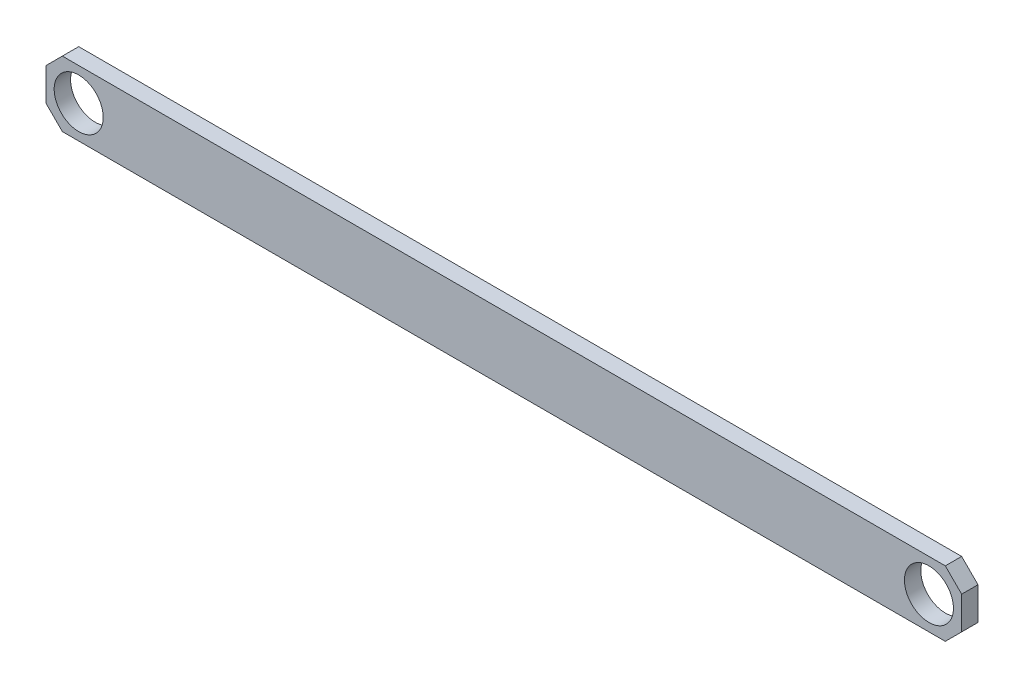
ISO-10303-21;
HEADER;
FILE_DESCRIPTION(('STEP AP214'),'2;1');
FILE_NAME('part.step','',(''),(''),'','','');
FILE_SCHEMA(('AUTOMOTIVE_DESIGN { 1 0 10303 214 1 1 1 1 }'));
ENDSEC;
DATA;
#1=APPLICATION_CONTEXT('core data for automotive mechanical design processes');
#2=APPLICATION_PROTOCOL_DEFINITION('international standard','automotive_design',2000,#1);
#3=PRODUCT_CONTEXT('',#1,'mechanical');
#4=PRODUCT('Part','Part','',(#3));
#5=PRODUCT_RELATED_PRODUCT_CATEGORY('part','',(#4));
#6=PRODUCT_DEFINITION_FORMATION('','',#4);
#7=PRODUCT_DEFINITION_CONTEXT('part definition',#1,'design');
#8=PRODUCT_DEFINITION('design','',#6,#7);
#9=PRODUCT_DEFINITION_SHAPE('','',#8);
#10=(LENGTH_UNIT() NAMED_UNIT(*) SI_UNIT(.MILLI.,.METRE.));
#11=(NAMED_UNIT(*) PLANE_ANGLE_UNIT() SI_UNIT($,.RADIAN.));
#12=(NAMED_UNIT(*) SI_UNIT($,.STERADIAN.) SOLID_ANGLE_UNIT());
#13=UNCERTAINTY_MEASURE_WITH_UNIT(LENGTH_MEASURE(1.E-05),#10,'distance_accuracy_value','');
#14=(GEOMETRIC_REPRESENTATION_CONTEXT(3) GLOBAL_UNCERTAINTY_ASSIGNED_CONTEXT((#13)) GLOBAL_UNIT_ASSIGNED_CONTEXT((#10,
#11,#12)) REPRESENTATION_CONTEXT('',''));
#15=CARTESIAN_POINT('',(0.,0.,0.));
#16=DIRECTION('',(0.,0.,1.));
#17=DIRECTION('',(1.,0.,0.));
#18=AXIS2_PLACEMENT_3D('',#15,#16,#17);
#19=CARTESIAN_POINT('',(0.,12.7,3.175));
#20=DIRECTION('',(0.,0.,-1.));
#21=DIRECTION('',(-1.,0.,0.));
#22=AXIS2_PLACEMENT_3D('',#19,#20,#21);
#23=PLANE('',#22);
#24=DIRECTION('',(-1.,0.,0.));
#25=VECTOR('',#24,1.);
#26=CARTESIAN_POINT('',(0.,12.7,3.175));
#27=LINE('',#26,#25);
#28=CARTESIAN_POINT('',(174.625,12.7,3.175));
#29=VERTEX_POINT('',#28);
#30=CARTESIAN_POINT('',(3.17500000000001,12.7,3.175));
#31=VERTEX_POINT('',#30);
#32=EDGE_CURVE('E135',#29,#31,#27,.T.);
#33=ORIENTED_EDGE('',*,*,#32,.T.);
#34=DIRECTION('',(0.707106781186549,0.707106781186546,0.));
#35=VECTOR('',#34,1.);
#36=CARTESIAN_POINT('',(0.,9.525,3.175));
#37=LINE('',#36,#35);
#38=CARTESIAN_POINT('',(0.,9.525,3.175));
#39=VERTEX_POINT('',#38);
#40=EDGE_CURVE('E154',#31,#39,#37,.F.);
#41=ORIENTED_EDGE('',*,*,#40,.T.);
#42=DIRECTION('',(0.,-1.,0.));
#43=VECTOR('',#42,1.);
#44=CARTESIAN_POINT('',(0.,0.,3.175));
#45=LINE('',#44,#43);
#46=CARTESIAN_POINT('',(0.,3.17500000000001,3.175));
#47=VERTEX_POINT('',#46);
#48=EDGE_CURVE('E118',#39,#47,#45,.T.);
#49=ORIENTED_EDGE('',*,*,#48,.T.);
#50=DIRECTION('',(-0.707106781186546,0.707106781186549,0.));
#51=VECTOR('',#50,1.);
#52=CARTESIAN_POINT('',(3.175,0.,3.175));
#53=LINE('',#52,#51);
#54=CARTESIAN_POINT('',(3.175,0.,3.175));
#55=VERTEX_POINT('',#54);
#56=EDGE_CURVE('E152',#47,#55,#53,.F.);
#57=ORIENTED_EDGE('',*,*,#56,.T.);
#58=DIRECTION('',(1.,0.,0.));
#59=VECTOR('',#58,1.);
#60=CARTESIAN_POINT('',(0.,0.,3.175));
#61=LINE('',#60,#59);
#62=CARTESIAN_POINT('',(174.625,0.,3.175));
#63=VERTEX_POINT('',#62);
#64=EDGE_CURVE('E165',#55,#63,#61,.T.);
#65=ORIENTED_EDGE('',*,*,#64,.T.);
#66=DIRECTION('',(-0.707106781186547,-0.707106781186548,0.));
#67=VECTOR('',#66,1.);
#68=CARTESIAN_POINT('',(177.8,3.17500000000001,3.175));
#69=LINE('',#68,#67);
#70=CARTESIAN_POINT('',(177.8,3.17500000000001,3.175));
#71=VERTEX_POINT('',#70);
#72=EDGE_CURVE('E53',#63,#71,#69,.F.);
#73=ORIENTED_EDGE('',*,*,#72,.T.);
#74=DIRECTION('',(0.,1.,0.));
#75=VECTOR('',#74,1.);
#76=CARTESIAN_POINT('',(177.8,0.,3.175));
#77=LINE('',#76,#75);
#78=CARTESIAN_POINT('',(177.8,9.525,3.175));
#79=VERTEX_POINT('',#78);
#80=EDGE_CURVE('E173',#71,#79,#77,.T.);
#81=ORIENTED_EDGE('',*,*,#80,.T.);
#82=DIRECTION('',(0.707106781186549,-0.707106781186546,0.));
#83=VECTOR('',#82,1.);
#84=CARTESIAN_POINT('',(174.625,12.7,3.175));
#85=LINE('',#84,#83);
#86=EDGE_CURVE('E149',#79,#29,#85,.F.);
#87=ORIENTED_EDGE('',*,*,#86,.T.);
#88=EDGE_LOOP('',(#33,#41,#49,#57,#65,#73,#81,#87));
#89=FACE_BOUND('',#88,.T.);
#90=CARTESIAN_POINT('',(6.35,6.35,3.175));
#91=DIRECTION('',(0.,0.,1.));
#92=DIRECTION('',(1.,0.,0.));
#93=AXIS2_PLACEMENT_3D('',#90,#91,#92);
#94=CIRCLE('',#93,4.7625);
#95=CARTESIAN_POINT('',(11.1125,6.35,3.175));
#96=VERTEX_POINT('',#95);
#97=EDGE_CURVE('E126',#96,#96,#94,.T.);
#98=ORIENTED_EDGE('',*,*,#97,.F.);
#99=EDGE_LOOP('',(#98));
#100=FACE_BOUND('',#99,.T.);
#101=CARTESIAN_POINT('',(171.45,6.35,3.175));
#102=DIRECTION('',(0.,0.,1.));
#103=DIRECTION('',(-1.,0.,0.));
#104=AXIS2_PLACEMENT_3D('',#101,#102,#103);
#105=CIRCLE('',#104,4.76249999999998);
#106=CARTESIAN_POINT('',(166.6875,6.35,3.175));
#107=VERTEX_POINT('',#106);
#108=EDGE_CURVE('E180',#107,#107,#105,.T.);
#109=ORIENTED_EDGE('',*,*,#108,.F.);
#110=EDGE_LOOP('',(#109));
#111=FACE_BOUND('',#110,.T.);
#112=ADVANCED_FACE('F32',(#89,#100,#111),#23,.F.);
#113=CARTESIAN_POINT('',(0.,12.7,0.));
#114=DIRECTION('',(0.,0.,-1.));
#115=DIRECTION('',(-1.,0.,0.));
#116=AXIS2_PLACEMENT_3D('',#113,#114,#115);
#117=PLANE('',#116);
#118=CARTESIAN_POINT('',(6.35,6.35,0.));
#119=DIRECTION('',(0.,0.,1.));
#120=DIRECTION('',(1.,0.,0.));
#121=AXIS2_PLACEMENT_3D('',#118,#119,#120);
#122=CIRCLE('',#121,4.7625);
#123=CARTESIAN_POINT('',(11.1125,6.35,0.));
#124=VERTEX_POINT('',#123);
#125=EDGE_CURVE('E132',#124,#124,#122,.T.);
#126=ORIENTED_EDGE('',*,*,#125,.T.);
#127=EDGE_LOOP('',(#126));
#128=FACE_BOUND('',#127,.T.);
#129=DIRECTION('',(0.,-1.,0.));
#130=VECTOR('',#129,1.);
#131=CARTESIAN_POINT('',(0.,0.,0.));
#132=LINE('',#131,#130);
#133=CARTESIAN_POINT('',(0.,9.525,0.));
#134=VERTEX_POINT('',#133);
#135=CARTESIAN_POINT('',(0.,3.17500000000001,0.));
#136=VERTEX_POINT('',#135);
#137=EDGE_CURVE('E115',#134,#136,#132,.T.);
#138=ORIENTED_EDGE('',*,*,#137,.F.);
#139=DIRECTION('',(-0.707106781186549,-0.707106781186546,0.));
#140=VECTOR('',#139,1.);
#141=CARTESIAN_POINT('',(1.5875,11.1125,0.));
#142=LINE('',#141,#140);
#143=CARTESIAN_POINT('',(3.17500000000001,12.7,0.));
#144=VERTEX_POINT('',#143);
#145=EDGE_CURVE('E98',#134,#144,#142,.F.);
#146=ORIENTED_EDGE('',*,*,#145,.T.);
#147=DIRECTION('',(-1.,0.,0.));
#148=VECTOR('',#147,1.);
#149=CARTESIAN_POINT('',(0.,12.7,0.));
#150=LINE('',#149,#148);
#151=CARTESIAN_POINT('',(174.625,12.7,0.));
#152=VERTEX_POINT('',#151);
#153=EDGE_CURVE('E139',#152,#144,#150,.T.);
#154=ORIENTED_EDGE('',*,*,#153,.F.);
#155=DIRECTION('',(-0.707106781186549,0.707106781186546,0.));
#156=VECTOR('',#155,1.);
#157=CARTESIAN_POINT('',(87.3124999999997,100.0125,0.));
#158=LINE('',#157,#156);
#159=CARTESIAN_POINT('',(177.8,9.525,0.));
#160=VERTEX_POINT('',#159);
#161=EDGE_CURVE('E119',#152,#160,#158,.F.);
#162=ORIENTED_EDGE('',*,*,#161,.T.);
#163=DIRECTION('',(0.,1.,0.));
#164=VECTOR('',#163,1.);
#165=CARTESIAN_POINT('',(177.8,0.,0.));
#166=LINE('',#165,#164);
#167=CARTESIAN_POINT('',(177.8,3.17500000000001,0.));
#168=VERTEX_POINT('',#167);
#169=EDGE_CURVE('E129',#168,#160,#166,.T.);
#170=ORIENTED_EDGE('',*,*,#169,.F.);
#171=DIRECTION('',(0.707106781186547,0.707106781186548,0.));
#172=VECTOR('',#171,1.);
#173=CARTESIAN_POINT('',(93.6625,-80.9625,0.));
#174=LINE('',#173,#172);
#175=CARTESIAN_POINT('',(174.625,0.,0.));
#176=VERTEX_POINT('',#175);
#177=EDGE_CURVE('E143',#168,#176,#174,.F.);
#178=ORIENTED_EDGE('',*,*,#177,.T.);
#179=DIRECTION('',(1.,0.,0.));
#180=VECTOR('',#179,1.);
#181=CARTESIAN_POINT('',(0.,0.,0.));
#182=LINE('',#181,#180);
#183=CARTESIAN_POINT('',(3.175,0.,0.));
#184=VERTEX_POINT('',#183);
#185=EDGE_CURVE('E125',#184,#176,#182,.T.);
#186=ORIENTED_EDGE('',*,*,#185,.F.);
#187=DIRECTION('',(0.707106781186546,-0.707106781186549,0.));
#188=VECTOR('',#187,1.);
#189=CARTESIAN_POINT('',(-4.76249999999999,7.93750000000002,0.));
#190=LINE('',#189,#188);
#191=EDGE_CURVE('E109',#184,#136,#190,.F.);
#192=ORIENTED_EDGE('',*,*,#191,.T.);
#193=EDGE_LOOP('',(#138,#146,#154,#162,#170,#178,#186,#192));
#194=FACE_BOUND('',#193,.T.);
#195=CARTESIAN_POINT('',(171.45,6.35,0.));
#196=DIRECTION('',(0.,0.,1.));
#197=DIRECTION('',(-1.,0.,0.));
#198=AXIS2_PLACEMENT_3D('',#195,#196,#197);
#199=CIRCLE('',#198,4.76249999999998);
#200=CARTESIAN_POINT('',(166.6875,6.35,0.));
#201=VERTEX_POINT('',#200);
#202=EDGE_CURVE('E182',#201,#201,#199,.T.);
#203=ORIENTED_EDGE('',*,*,#202,.T.);
#204=EDGE_LOOP('',(#203));
#205=FACE_BOUND('',#204,.T.);
#206=ADVANCED_FACE('F122',(#128,#194,#205),#117,.T.);
#207=CARTESIAN_POINT('',(0.,0.,3.175));
#208=DIRECTION('',(1.,0.,0.));
#209=DIRECTION('',(0.,0.,-1.));
#210=AXIS2_PLACEMENT_3D('',#207,#208,#209);
#211=PLANE('',#210);
#212=ORIENTED_EDGE('',*,*,#48,.F.);
#213=DIRECTION('',(0.,0.,-1.));
#214=VECTOR('',#213,1.);
#215=CARTESIAN_POINT('',(0.,9.525,3.175));
#216=LINE('',#215,#214);
#217=EDGE_CURVE('E102',#39,#134,#216,.T.);
#218=ORIENTED_EDGE('',*,*,#217,.T.);
#219=ORIENTED_EDGE('',*,*,#137,.T.);
#220=DIRECTION('',(0.,0.,1.));
#221=VECTOR('',#220,1.);
#222=CARTESIAN_POINT('',(0.,3.17500000000001,3.175));
#223=LINE('',#222,#221);
#224=EDGE_CURVE('E120',#136,#47,#223,.T.);
#225=ORIENTED_EDGE('',*,*,#224,.T.);
#226=EDGE_LOOP('',(#212,#218,#219,#225));
#227=FACE_BOUND('',#226,.T.);
#228=ADVANCED_FACE('F114',(#227),#211,.F.);
#229=CARTESIAN_POINT('',(0.,0.,3.175));
#230=DIRECTION('',(0.,1.,0.));
#231=DIRECTION('',(0.,0.,1.));
#232=AXIS2_PLACEMENT_3D('',#229,#230,#231);
#233=PLANE('',#232);
#234=ORIENTED_EDGE('',*,*,#64,.F.);
#235=DIRECTION('',(0.,0.,-1.));
#236=VECTOR('',#235,1.);
#237=CARTESIAN_POINT('',(3.175,0.,3.175));
#238=LINE('',#237,#236);
#239=EDGE_CURVE('E158',#55,#184,#238,.T.);
#240=ORIENTED_EDGE('',*,*,#239,.T.);
#241=ORIENTED_EDGE('',*,*,#185,.T.);
#242=DIRECTION('',(0.,0.,1.));
#243=VECTOR('',#242,1.);
#244=CARTESIAN_POINT('',(174.625,0.,3.175));
#245=LINE('',#244,#243);
#246=EDGE_CURVE('E156',#176,#63,#245,.T.);
#247=ORIENTED_EDGE('',*,*,#246,.T.);
#248=EDGE_LOOP('',(#234,#240,#241,#247));
#249=FACE_BOUND('',#248,.T.);
#250=ADVANCED_FACE('F163',(#249),#233,.F.);
#251=CARTESIAN_POINT('',(177.8,0.,3.175));
#252=DIRECTION('',(-1.,0.,0.));
#253=DIRECTION('',(0.,0.,1.));
#254=AXIS2_PLACEMENT_3D('',#251,#252,#253);
#255=PLANE('',#254);
#256=ORIENTED_EDGE('',*,*,#80,.F.);
#257=DIRECTION('',(0.,0.,-1.));
#258=VECTOR('',#257,1.);
#259=CARTESIAN_POINT('',(177.8,3.17500000000001,3.175));
#260=LINE('',#259,#258);
#261=EDGE_CURVE('E11',#71,#168,#260,.T.);
#262=ORIENTED_EDGE('',*,*,#261,.T.);
#263=ORIENTED_EDGE('',*,*,#169,.T.);
#264=DIRECTION('',(0.,0.,1.));
#265=VECTOR('',#264,1.);
#266=CARTESIAN_POINT('',(177.8,9.525,3.175));
#267=LINE('',#266,#265);
#268=EDGE_CURVE('E40',#160,#79,#267,.T.);
#269=ORIENTED_EDGE('',*,*,#268,.T.);
#270=EDGE_LOOP('',(#256,#262,#263,#269));
#271=FACE_BOUND('',#270,.T.);
#272=ADVANCED_FACE('F172',(#271),#255,.F.);
#273=CARTESIAN_POINT('',(0.,12.7,3.175));
#274=DIRECTION('',(0.,-1.,0.));
#275=DIRECTION('',(0.,0.,-1.));
#276=AXIS2_PLACEMENT_3D('',#273,#274,#275);
#277=PLANE('',#276);
#278=ORIENTED_EDGE('',*,*,#153,.T.);
#279=DIRECTION('',(0.,0.,1.));
#280=VECTOR('',#279,1.);
#281=CARTESIAN_POINT('',(3.17500000000001,12.7,3.175));
#282=LINE('',#281,#280);
#283=EDGE_CURVE('E103',#144,#31,#282,.T.);
#284=ORIENTED_EDGE('',*,*,#283,.T.);
#285=ORIENTED_EDGE('',*,*,#32,.F.);
#286=DIRECTION('',(0.,0.,-1.));
#287=VECTOR('',#286,1.);
#288=CARTESIAN_POINT('',(174.625,12.7,3.175));
#289=LINE('',#288,#287);
#290=EDGE_CURVE('E108',#29,#152,#289,.T.);
#291=ORIENTED_EDGE('',*,*,#290,.T.);
#292=EDGE_LOOP('',(#278,#284,#285,#291));
#293=FACE_BOUND('',#292,.T.);
#294=ADVANCED_FACE('F203',(#293),#277,.F.);
#295=CARTESIAN_POINT('',(6.35,6.35,3.175));
#296=DIRECTION('',(0.,0.,-1.));
#297=DIRECTION('',(-1.,0.,0.));
#298=AXIS2_PLACEMENT_3D('',#295,#296,#297);
#299=CYLINDRICAL_SURFACE('',#298,4.7625);
#300=ORIENTED_EDGE('',*,*,#97,.T.);
#301=EDGE_LOOP('',(#300));
#302=FACE_BOUND('',#301,.T.);
#303=ORIENTED_EDGE('',*,*,#125,.F.);
#304=EDGE_LOOP('',(#303));
#305=FACE_BOUND('',#304,.T.);
#306=ADVANCED_FACE('F200',(#302,#305),#299,.F.);
#307=CARTESIAN_POINT('',(171.45,6.35,3.175));
#308=DIRECTION('',(0.,0.,-1.));
#309=DIRECTION('',(-1.,0.,0.));
#310=AXIS2_PLACEMENT_3D('',#307,#308,#309);
#311=CYLINDRICAL_SURFACE('',#310,4.76249999999998);
#312=ORIENTED_EDGE('',*,*,#108,.T.);
#313=EDGE_LOOP('',(#312));
#314=FACE_BOUND('',#313,.T.);
#315=ORIENTED_EDGE('',*,*,#202,.F.);
#316=EDGE_LOOP('',(#315));
#317=FACE_BOUND('',#316,.T.);
#318=ADVANCED_FACE('F188',(#314,#317),#311,.F.);
#319=CARTESIAN_POINT('',(0.,9.525,3.175));
#320=DIRECTION('',(0.707106781186546,-0.707106781186549,0.));
#321=DIRECTION('',(0.707106781186549,0.707106781186546,0.));
#322=AXIS2_PLACEMENT_3D('',#319,#320,#321);
#323=PLANE('',#322);
#324=ORIENTED_EDGE('',*,*,#40,.F.);
#325=ORIENTED_EDGE('',*,*,#283,.F.);
#326=ORIENTED_EDGE('',*,*,#145,.F.);
#327=ORIENTED_EDGE('',*,*,#217,.F.);
#328=EDGE_LOOP('',(#324,#325,#326,#327));
#329=FACE_BOUND('',#328,.T.);
#330=ADVANCED_FACE('F101',(#329),#323,.F.);
#331=CARTESIAN_POINT('',(3.175,0.,3.175));
#332=DIRECTION('',(0.707106781186549,0.707106781186546,0.));
#333=DIRECTION('',(-0.707106781186546,0.707106781186549,0.));
#334=AXIS2_PLACEMENT_3D('',#331,#332,#333);
#335=PLANE('',#334);
#336=ORIENTED_EDGE('',*,*,#56,.F.);
#337=ORIENTED_EDGE('',*,*,#224,.F.);
#338=ORIENTED_EDGE('',*,*,#191,.F.);
#339=ORIENTED_EDGE('',*,*,#239,.F.);
#340=EDGE_LOOP('',(#336,#337,#338,#339));
#341=FACE_BOUND('',#340,.T.);
#342=ADVANCED_FACE('F215',(#341),#335,.F.);
#343=CARTESIAN_POINT('',(177.8,3.17500000000001,3.175));
#344=DIRECTION('',(-0.707106781186547,0.707106781186547,0.));
#345=DIRECTION('',(-0.707106781186547,-0.707106781186548,0.));
#346=AXIS2_PLACEMENT_3D('',#343,#344,#345);
#347=PLANE('',#346);
#348=ORIENTED_EDGE('',*,*,#72,.F.);
#349=ORIENTED_EDGE('',*,*,#246,.F.);
#350=ORIENTED_EDGE('',*,*,#177,.F.);
#351=ORIENTED_EDGE('',*,*,#261,.F.);
#352=EDGE_LOOP('',(#348,#349,#350,#351));
#353=FACE_BOUND('',#352,.T.);
#354=ADVANCED_FACE('F171',(#353),#347,.F.);
#355=CARTESIAN_POINT('',(174.625,12.7,3.175));
#356=DIRECTION('',(-0.707106781186546,-0.707106781186549,0.));
#357=DIRECTION('',(0.707106781186549,-0.707106781186546,0.));
#358=AXIS2_PLACEMENT_3D('',#355,#356,#357);
#359=PLANE('',#358);
#360=ORIENTED_EDGE('',*,*,#86,.F.);
#361=ORIENTED_EDGE('',*,*,#268,.F.);
#362=ORIENTED_EDGE('',*,*,#161,.F.);
#363=ORIENTED_EDGE('',*,*,#290,.F.);
#364=EDGE_LOOP('',(#360,#361,#362,#363));
#365=FACE_BOUND('',#364,.T.);
#366=ADVANCED_FACE('F34',(#365),#359,.F.);
#367=CLOSED_SHELL('',(#112,#206,#228,#250,#272,#294,#306,#318,#330,#342,#354,#366));
#368=MANIFOLD_SOLID_BREP('B2',#367);
#369=ADVANCED_BREP_SHAPE_REPRESENTATION('',(#18,#368),#14);
#370=SHAPE_DEFINITION_REPRESENTATION(#9,#369);
ENDSEC;
END-ISO-10303-21;
